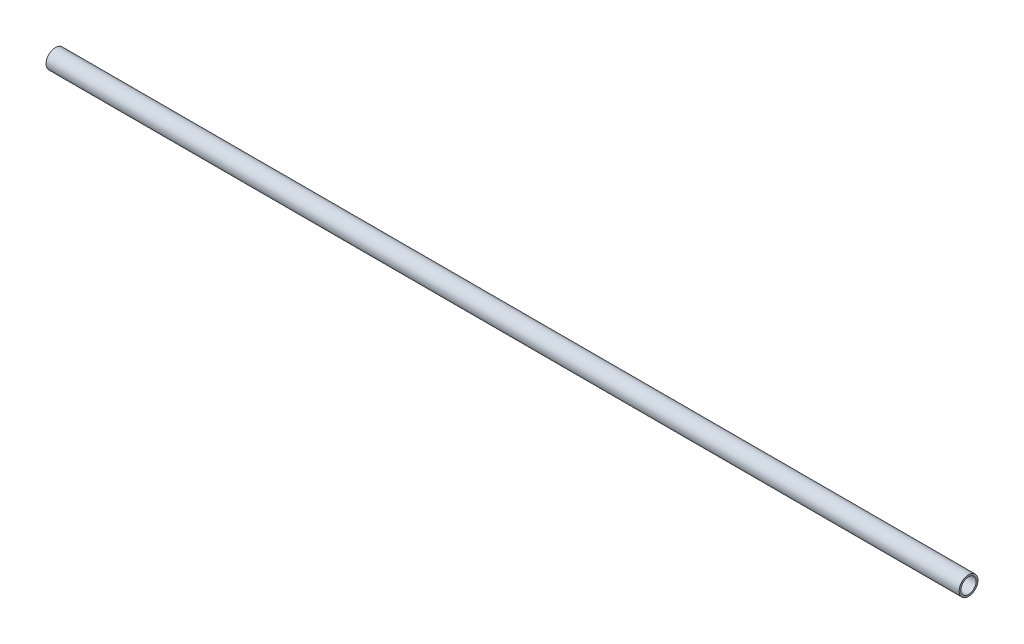
ISO-10303-21;
HEADER;
FILE_DESCRIPTION(('STEP AP214'),'2;1');
FILE_NAME('part.step','',(''),(''),'','','');
FILE_SCHEMA(('AUTOMOTIVE_DESIGN { 1 0 10303 214 1 1 1 1 }'));
ENDSEC;
DATA;
#1=APPLICATION_CONTEXT('core data for automotive mechanical design processes');
#2=APPLICATION_PROTOCOL_DEFINITION('international standard','automotive_design',2000,#1);
#3=PRODUCT_CONTEXT('',#1,'mechanical');
#4=PRODUCT('Part','Part','',(#3));
#5=PRODUCT_RELATED_PRODUCT_CATEGORY('part','',(#4));
#6=PRODUCT_DEFINITION_FORMATION('','',#4);
#7=PRODUCT_DEFINITION_CONTEXT('part definition',#1,'design');
#8=PRODUCT_DEFINITION('design','',#6,#7);
#9=PRODUCT_DEFINITION_SHAPE('','',#8);
#10=(LENGTH_UNIT() NAMED_UNIT(*) SI_UNIT(.MILLI.,.METRE.));
#11=(NAMED_UNIT(*) PLANE_ANGLE_UNIT() SI_UNIT($,.RADIAN.));
#12=(NAMED_UNIT(*) SI_UNIT($,.STERADIAN.) SOLID_ANGLE_UNIT());
#13=UNCERTAINTY_MEASURE_WITH_UNIT(LENGTH_MEASURE(1.E-05),#10,'distance_accuracy_value','');
#14=(GEOMETRIC_REPRESENTATION_CONTEXT(3) GLOBAL_UNCERTAINTY_ASSIGNED_CONTEXT((#13)) GLOBAL_UNIT_ASSIGNED_CONTEXT((#10,
#11,#12)) REPRESENTATION_CONTEXT('',''));
#15=CARTESIAN_POINT('',(0.,0.,0.));
#16=DIRECTION('',(0.,0.,1.));
#17=DIRECTION('',(1.,0.,0.));
#18=AXIS2_PLACEMENT_3D('',#15,#16,#17);
#19=CARTESIAN_POINT('',(644.525,0.,0.));
#20=DIRECTION('',(-1.,0.,0.));
#21=DIRECTION('',(0.,0.,1.));
#22=AXIS2_PLACEMENT_3D('',#19,#20,#21);
#23=CYLINDRICAL_SURFACE('',#22,10.795);
#24=CARTESIAN_POINT('',(-644.525,0.,0.));
#25=DIRECTION('',(-1.,0.,0.));
#26=DIRECTION('',(0.,0.,1.));
#27=AXIS2_PLACEMENT_3D('',#24,#25,#26);
#28=CIRCLE('',#27,10.795);
#29=CARTESIAN_POINT('',(-644.525,0.,10.795));
#30=VERTEX_POINT('',#29);
#31=EDGE_CURVE('E27',#30,#30,#28,.T.);
#32=ORIENTED_EDGE('',*,*,#31,.T.);
#33=EDGE_LOOP('',(#32));
#34=FACE_BOUND('',#33,.T.);
#35=CARTESIAN_POINT('',(644.525,0.,0.));
#36=DIRECTION('',(-1.,0.,0.));
#37=DIRECTION('',(0.,0.,1.));
#38=AXIS2_PLACEMENT_3D('',#35,#36,#37);
#39=CIRCLE('',#38,10.795);
#40=CARTESIAN_POINT('',(644.525,0.,10.795));
#41=VERTEX_POINT('',#40);
#42=EDGE_CURVE('E18',#41,#41,#39,.T.);
#43=ORIENTED_EDGE('',*,*,#42,.F.);
#44=EDGE_LOOP('',(#43));
#45=FACE_BOUND('',#44,.T.);
#46=ADVANCED_FACE('F15',(#34,#45),#23,.F.);
#47=CARTESIAN_POINT('',(644.525,0.,0.));
#48=DIRECTION('',(1.,0.,0.));
#49=DIRECTION('',(0.,0.,-1.));
#50=AXIS2_PLACEMENT_3D('',#47,#48,#49);
#51=PLANE('',#50);
#52=ORIENTED_EDGE('',*,*,#42,.T.);
#53=EDGE_LOOP('',(#52));
#54=FACE_BOUND('',#53,.T.);
#55=CARTESIAN_POINT('',(644.525,0.,0.));
#56=DIRECTION('',(-1.,0.,0.));
#57=DIRECTION('',(0.,0.,1.));
#58=AXIS2_PLACEMENT_3D('',#55,#56,#57);
#59=CIRCLE('',#58,13.335);
#60=CARTESIAN_POINT('',(644.525,0.,13.335));
#61=VERTEX_POINT('',#60);
#62=EDGE_CURVE('E22',#61,#61,#59,.T.);
#63=ORIENTED_EDGE('',*,*,#62,.F.);
#64=EDGE_LOOP('',(#63));
#65=FACE_BOUND('',#64,.T.);
#66=ADVANCED_FACE('F35',(#54,#65),#51,.T.);
#67=CARTESIAN_POINT('',(-644.525,0.,0.));
#68=DIRECTION('',(1.,0.,0.));
#69=DIRECTION('',(0.,0.,-1.));
#70=AXIS2_PLACEMENT_3D('',#67,#68,#69);
#71=PLANE('',#70);
#72=ORIENTED_EDGE('',*,*,#31,.F.);
#73=EDGE_LOOP('',(#72));
#74=FACE_BOUND('',#73,.T.);
#75=CARTESIAN_POINT('',(-644.525,0.,0.));
#76=DIRECTION('',(-1.,0.,0.));
#77=DIRECTION('',(0.,0.,1.));
#78=AXIS2_PLACEMENT_3D('',#75,#76,#77);
#79=CIRCLE('',#78,13.335);
#80=CARTESIAN_POINT('',(-644.525,0.,13.335));
#81=VERTEX_POINT('',#80);
#82=EDGE_CURVE('E10',#81,#81,#79,.F.);
#83=ORIENTED_EDGE('',*,*,#82,.F.);
#84=EDGE_LOOP('',(#83));
#85=FACE_BOUND('',#84,.T.);
#86=ADVANCED_FACE('F43',(#74,#85),#71,.F.);
#87=CARTESIAN_POINT('',(644.525,0.,0.));
#88=DIRECTION('',(-1.,0.,0.));
#89=DIRECTION('',(0.,0.,1.));
#90=AXIS2_PLACEMENT_3D('',#87,#88,#89);
#91=CYLINDRICAL_SURFACE('',#90,13.335);
#92=ORIENTED_EDGE('',*,*,#82,.T.);
#93=EDGE_LOOP('',(#92));
#94=FACE_BOUND('',#93,.T.);
#95=ORIENTED_EDGE('',*,*,#62,.T.);
#96=EDGE_LOOP('',(#95));
#97=FACE_BOUND('',#96,.T.);
#98=ADVANCED_FACE('F44',(#94,#97),#91,.T.);
#99=CLOSED_SHELL('',(#46,#66,#86,#98));
#100=MANIFOLD_SOLID_BREP('B1',#99);
#101=ADVANCED_BREP_SHAPE_REPRESENTATION('',(#18,#100),#14);
#102=SHAPE_DEFINITION_REPRESENTATION(#9,#101);
ENDSEC;
END-ISO-10303-21;
